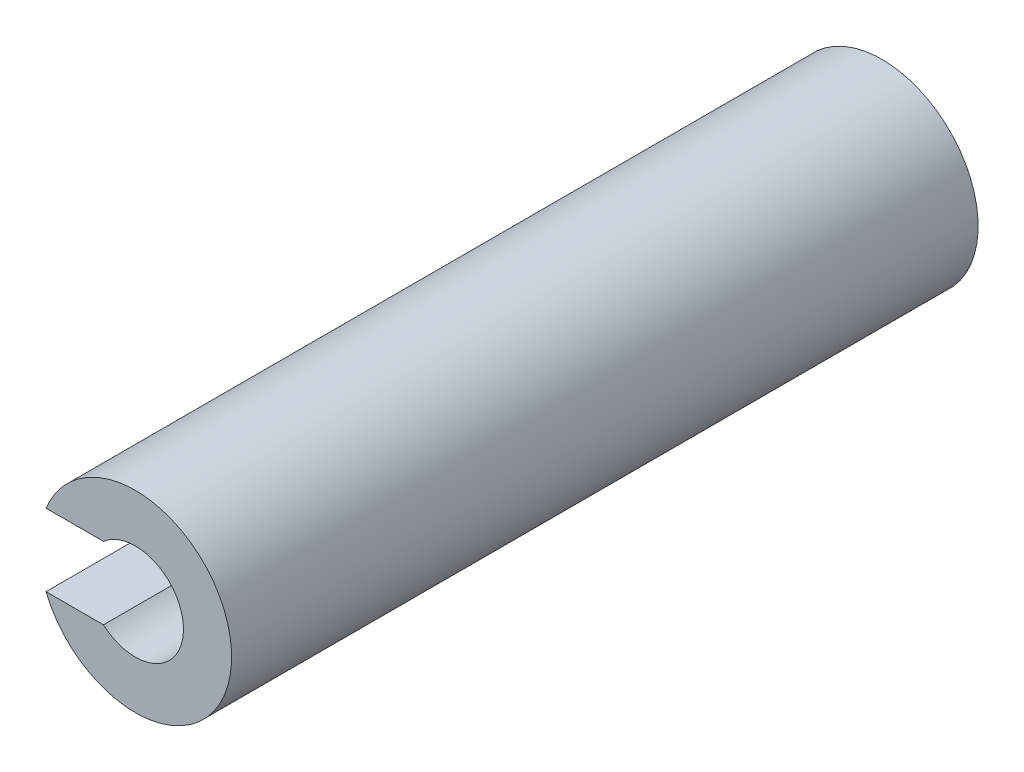
ISO-10303-21;
HEADER;
FILE_DESCRIPTION(('STEP AP214'),'2;1');
FILE_NAME('part.step','',(''),(''),'','','');
FILE_SCHEMA(('AUTOMOTIVE_DESIGN { 1 0 10303 214 1 1 1 1 }'));
ENDSEC;
DATA;
#1=APPLICATION_CONTEXT('core data for automotive mechanical design processes');
#2=APPLICATION_PROTOCOL_DEFINITION('international standard','automotive_design',2000,#1);
#3=PRODUCT_CONTEXT('',#1,'mechanical');
#4=PRODUCT('Part','Part','',(#3));
#5=PRODUCT_RELATED_PRODUCT_CATEGORY('part','',(#4));
#6=PRODUCT_DEFINITION_FORMATION('','',#4);
#7=PRODUCT_DEFINITION_CONTEXT('part definition',#1,'design');
#8=PRODUCT_DEFINITION('design','',#6,#7);
#9=PRODUCT_DEFINITION_SHAPE('','',#8);
#10=(LENGTH_UNIT() NAMED_UNIT(*) SI_UNIT(.MILLI.,.METRE.));
#11=(NAMED_UNIT(*) PLANE_ANGLE_UNIT() SI_UNIT($,.RADIAN.));
#12=(NAMED_UNIT(*) SI_UNIT($,.STERADIAN.) SOLID_ANGLE_UNIT());
#13=UNCERTAINTY_MEASURE_WITH_UNIT(LENGTH_MEASURE(1.E-05),#10,'distance_accuracy_value','');
#14=(GEOMETRIC_REPRESENTATION_CONTEXT(3) GLOBAL_UNCERTAINTY_ASSIGNED_CONTEXT((#13)) GLOBAL_UNIT_ASSIGNED_CONTEXT((#10,
#11,#12)) REPRESENTATION_CONTEXT('',''));
#15=CARTESIAN_POINT('',(0.,0.,0.));
#16=DIRECTION('',(0.,0.,1.));
#17=DIRECTION('',(1.,0.,0.));
#18=AXIS2_PLACEMENT_3D('',#15,#16,#17);
#19=CARTESIAN_POINT('',(2.05002319136388E-10,-10.6445650991783,-59.8962930809034));
#20=DIRECTION('',(0.,0.,-1.));
#21=DIRECTION('',(-1.,0.,0.));
#22=AXIS2_PLACEMENT_3D('',#19,#20,#21);
#23=CYLINDRICAL_SURFACE('',#22,4.);
#24=DIRECTION('',(0.,0.,-1.));
#25=VECTOR('',#24,1.);
#26=CARTESIAN_POINT('',(-3.70809924334283,-12.1445650991783,-59.8962930809034));
#27=LINE('',#26,#25);
#28=CARTESIAN_POINT('',(-3.70809924334283,-12.1445650991783,-59.8962930809034));
#29=VERTEX_POINT('',#28);
#30=CARTESIAN_POINT('',(-3.70809924334283,-12.1445650991783,-90.8962930809034));
#31=VERTEX_POINT('',#30);
#32=EDGE_CURVE('E108',#29,#31,#27,.T.);
#33=ORIENTED_EDGE('',*,*,#32,.T.);
#34=CARTESIAN_POINT('',(2.05002319136388E-10,-10.6445650991783,-90.8962930809034));
#35=DIRECTION('',(0.,0.,1.));
#36=DIRECTION('',(1.,0.,0.));
#37=AXIS2_PLACEMENT_3D('',#34,#35,#36);
#38=CIRCLE('',#37,4.);
#39=CARTESIAN_POINT('',(-3.70809924334283,-9.14456509917835,-90.8962930809034));
#40=VERTEX_POINT('',#39);
#41=EDGE_CURVE('E98',#40,#31,#38,.F.);
#42=ORIENTED_EDGE('',*,*,#41,.F.);
#43=DIRECTION('',(0.,0.,-1.));
#44=VECTOR('',#43,1.);
#45=CARTESIAN_POINT('',(-3.70809924334283,-9.14456509917834,-59.8962930809034));
#46=LINE('',#45,#44);
#47=CARTESIAN_POINT('',(-3.70809924334283,-9.14456509917834,-59.8962930809034));
#48=VERTEX_POINT('',#47);
#49=EDGE_CURVE('E12',#48,#40,#46,.T.);
#50=ORIENTED_EDGE('',*,*,#49,.F.);
#51=CARTESIAN_POINT('',(2.05002319136388E-10,-10.6445650991783,-59.8962930809034));
#52=DIRECTION('',(0.,0.,1.));
#53=DIRECTION('',(1.,0.,0.));
#54=AXIS2_PLACEMENT_3D('',#51,#52,#53);
#55=CIRCLE('',#54,4.);
#56=EDGE_CURVE('E97',#29,#48,#55,.T.);
#57=ORIENTED_EDGE('',*,*,#56,.F.);
#58=EDGE_LOOP('',(#33,#42,#50,#57));
#59=FACE_BOUND('',#58,.T.);
#60=ADVANCED_FACE('F40',(#59),#23,.T.);
#61=CARTESIAN_POINT('',(-1.99999999979493,-9.14456509917834,-59.8962930809034));
#62=DIRECTION('',(0.,1.,0.));
#63=DIRECTION('',(-1.,0.,0.));
#64=AXIS2_PLACEMENT_3D('',#61,#62,#63);
#65=PLANE('',#64);
#66=ORIENTED_EDGE('',*,*,#49,.T.);
#67=DIRECTION('',(-1.,0.,0.));
#68=VECTOR('',#67,1.);
#69=CARTESIAN_POINT('',(-1.99999999979493,-9.14456509917834,-90.8962930809034));
#70=LINE('',#69,#68);
#71=CARTESIAN_POINT('',(-1.32287565532723,-9.14456509917834,-90.8962930809034));
#72=VERTEX_POINT('',#71);
#73=EDGE_CURVE('E90',#72,#40,#70,.T.);
#74=ORIENTED_EDGE('',*,*,#73,.F.);
#75=DIRECTION('',(0.,0.,-1.));
#76=VECTOR('',#75,1.);
#77=CARTESIAN_POINT('',(-1.32287565532723,-9.14456509917834,-59.8962930809034));
#78=LINE('',#77,#76);
#79=CARTESIAN_POINT('',(-1.32287565532723,-9.14456509917834,-59.8962930809034));
#80=VERTEX_POINT('',#79);
#81=EDGE_CURVE('E47',#80,#72,#78,.T.);
#82=ORIENTED_EDGE('',*,*,#81,.F.);
#83=DIRECTION('',(1.,0.,0.));
#84=VECTOR('',#83,1.);
#85=CARTESIAN_POINT('',(-1.99999999979493,-9.14456509917834,-59.8962930809034));
#86=LINE('',#85,#84);
#87=EDGE_CURVE('E100',#48,#80,#86,.T.);
#88=ORIENTED_EDGE('',*,*,#87,.F.);
#89=EDGE_LOOP('',(#66,#74,#82,#88));
#90=FACE_BOUND('',#89,.T.);
#91=ADVANCED_FACE('F95',(#90),#65,.F.);
#92=CARTESIAN_POINT('',(2.05002319136388E-10,-10.6445650991783,-59.8962930809034));
#93=DIRECTION('',(0.,0.,-1.));
#94=DIRECTION('',(-1.,0.,0.));
#95=AXIS2_PLACEMENT_3D('',#92,#93,#94);
#96=CYLINDRICAL_SURFACE('',#95,1.99999999999996);
#97=ORIENTED_EDGE('',*,*,#81,.T.);
#98=CARTESIAN_POINT('',(2.05002319136388E-10,-10.6445650991783,-90.8962930809034));
#99=DIRECTION('',(0.,0.,1.));
#100=DIRECTION('',(1.,0.,0.));
#101=AXIS2_PLACEMENT_3D('',#98,#99,#100);
#102=CIRCLE('',#101,1.99999999999996);
#103=CARTESIAN_POINT('',(-1.32287565532723,-12.1445650991783,-90.8962930809034));
#104=VERTEX_POINT('',#103);
#105=EDGE_CURVE('E81',#104,#72,#102,.T.);
#106=ORIENTED_EDGE('',*,*,#105,.F.);
#107=DIRECTION('',(0.,0.,-1.));
#108=VECTOR('',#107,1.);
#109=CARTESIAN_POINT('',(-1.32287565532723,-12.1445650991783,-59.8962930809034));
#110=LINE('',#109,#108);
#111=CARTESIAN_POINT('',(-1.32287565532723,-12.1445650991783,-59.8962930809034));
#112=VERTEX_POINT('',#111);
#113=EDGE_CURVE('E84',#112,#104,#110,.T.);
#114=ORIENTED_EDGE('',*,*,#113,.F.);
#115=CARTESIAN_POINT('',(2.05002319136388E-10,-10.6445650991783,-59.8962930809034));
#116=DIRECTION('',(0.,0.,-1.));
#117=DIRECTION('',(1.,0.,0.));
#118=AXIS2_PLACEMENT_3D('',#115,#116,#117);
#119=CIRCLE('',#118,1.99999999999996);
#120=EDGE_CURVE('E59',#80,#112,#119,.T.);
#121=ORIENTED_EDGE('',*,*,#120,.F.);
#122=EDGE_LOOP('',(#97,#106,#114,#121));
#123=FACE_BOUND('',#122,.T.);
#124=ADVANCED_FACE('F80',(#123),#96,.F.);
#125=CARTESIAN_POINT('',(-3.70809924334283,-12.1445650991783,-59.8962930809034));
#126=DIRECTION('',(0.,-1.,0.));
#127=DIRECTION('',(1.,0.,0.));
#128=AXIS2_PLACEMENT_3D('',#125,#126,#127);
#129=PLANE('',#128);
#130=ORIENTED_EDGE('',*,*,#113,.T.);
#131=DIRECTION('',(1.,0.,0.));
#132=VECTOR('',#131,1.);
#133=CARTESIAN_POINT('',(-3.70809924334283,-12.1445650991783,-90.8962930809034));
#134=LINE('',#133,#132);
#135=EDGE_CURVE('E93',#31,#104,#134,.T.);
#136=ORIENTED_EDGE('',*,*,#135,.F.);
#137=ORIENTED_EDGE('',*,*,#32,.F.);
#138=DIRECTION('',(-1.,0.,0.));
#139=VECTOR('',#138,1.);
#140=CARTESIAN_POINT('',(-3.70809924334283,-12.1445650991783,-59.8962930809034));
#141=LINE('',#140,#139);
#142=EDGE_CURVE('E54',#112,#29,#141,.T.);
#143=ORIENTED_EDGE('',*,*,#142,.F.);
#144=EDGE_LOOP('',(#130,#136,#137,#143));
#145=FACE_BOUND('',#144,.T.);
#146=ADVANCED_FACE('F111',(#145),#129,.F.);
#147=CARTESIAN_POINT('',(2.05002319136388E-10,-10.6445650991783,-59.8962930809034));
#148=DIRECTION('',(0.,0.,1.));
#149=DIRECTION('',(1.,0.,0.));
#150=AXIS2_PLACEMENT_3D('',#147,#148,#149);
#151=PLANE('',#150);
#152=ORIENTED_EDGE('',*,*,#56,.T.);
#153=ORIENTED_EDGE('',*,*,#87,.T.);
#154=ORIENTED_EDGE('',*,*,#120,.T.);
#155=ORIENTED_EDGE('',*,*,#142,.T.);
#156=EDGE_LOOP('',(#152,#153,#154,#155));
#157=FACE_BOUND('',#156,.T.);
#158=ADVANCED_FACE('F114',(#157),#151,.T.);
#159=CARTESIAN_POINT('',(2.05120809804894E-10,-10.6445650991783,-90.8962930809034));
#160=DIRECTION('',(0.,0.,1.));
#161=DIRECTION('',(-1.,0.,0.));
#162=AXIS2_PLACEMENT_3D('',#159,#160,#161);
#163=PLANE('',#162);
#164=ORIENTED_EDGE('',*,*,#41,.T.);
#165=ORIENTED_EDGE('',*,*,#135,.T.);
#166=ORIENTED_EDGE('',*,*,#105,.T.);
#167=ORIENTED_EDGE('',*,*,#73,.T.);
#168=EDGE_LOOP('',(#164,#165,#166,#167));
#169=FACE_BOUND('',#168,.T.);
#170=ADVANCED_FACE('F89',(#169),#163,.F.);
#171=CLOSED_SHELL('',(#60,#91,#124,#146,#158,#170));
#172=MANIFOLD_SOLID_BREP('B2',#171);
#173=ADVANCED_BREP_SHAPE_REPRESENTATION('',(#18,#172),#14);
#174=SHAPE_DEFINITION_REPRESENTATION(#9,#173);
ENDSEC;
END-ISO-10303-21;
